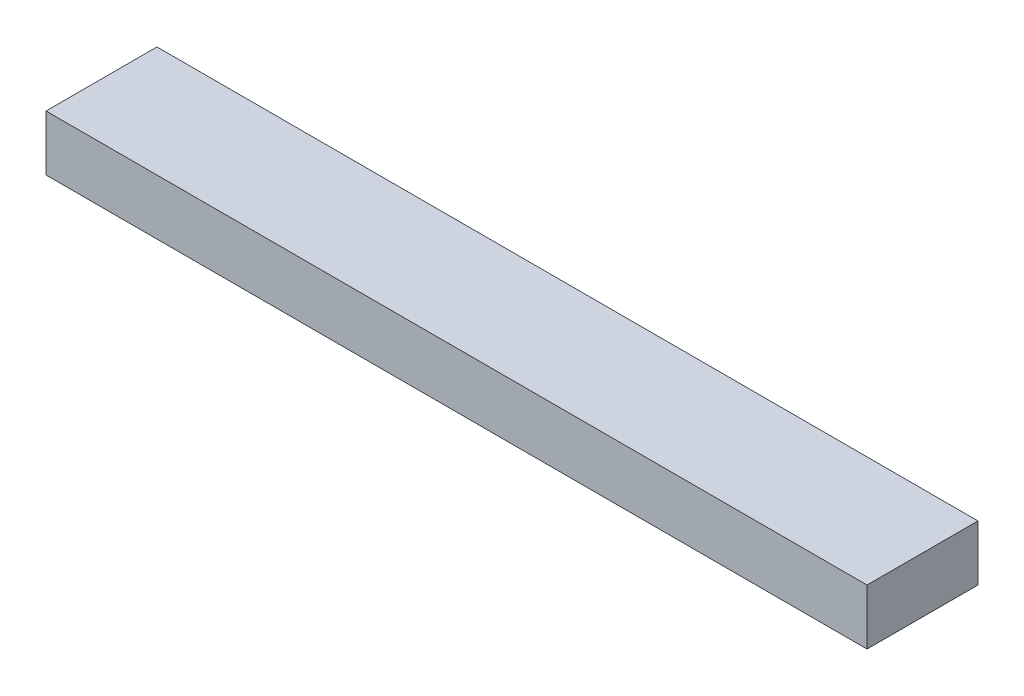
ISO-10303-21;
HEADER;
FILE_DESCRIPTION(('STEP AP214'),'2;1');
FILE_NAME('part.step','',(''),(''),'','','');
FILE_SCHEMA(('AUTOMOTIVE_DESIGN { 1 0 10303 214 1 1 1 1 }'));
ENDSEC;
DATA;
#1=APPLICATION_CONTEXT('core data for automotive mechanical design processes');
#2=APPLICATION_PROTOCOL_DEFINITION('international standard','automotive_design',2000,#1);
#3=PRODUCT_CONTEXT('',#1,'mechanical');
#4=PRODUCT('Part','Part','',(#3));
#5=PRODUCT_RELATED_PRODUCT_CATEGORY('part','',(#4));
#6=PRODUCT_DEFINITION_FORMATION('','',#4);
#7=PRODUCT_DEFINITION_CONTEXT('part definition',#1,'design');
#8=PRODUCT_DEFINITION('design','',#6,#7);
#9=PRODUCT_DEFINITION_SHAPE('','',#8);
#10=(LENGTH_UNIT() NAMED_UNIT(*) SI_UNIT(.MILLI.,.METRE.));
#11=(NAMED_UNIT(*) PLANE_ANGLE_UNIT() SI_UNIT($,.RADIAN.));
#12=(NAMED_UNIT(*) SI_UNIT($,.STERADIAN.) SOLID_ANGLE_UNIT());
#13=UNCERTAINTY_MEASURE_WITH_UNIT(LENGTH_MEASURE(1.E-05),#10,'distance_accuracy_value','');
#14=(GEOMETRIC_REPRESENTATION_CONTEXT(3) GLOBAL_UNCERTAINTY_ASSIGNED_CONTEXT((#13)) GLOBAL_UNIT_ASSIGNED_CONTEXT((#10,
#11,#12)) REPRESENTATION_CONTEXT('',''));
#15=CARTESIAN_POINT('',(0.,0.,0.));
#16=DIRECTION('',(0.,0.,1.));
#17=DIRECTION('',(1.,0.,0.));
#18=AXIS2_PLACEMENT_3D('',#15,#16,#17);
#19=CARTESIAN_POINT('',(23.495,3.175,3.175));
#20=DIRECTION('',(-1.,0.,0.));
#21=DIRECTION('',(0.,0.,1.));
#22=AXIS2_PLACEMENT_3D('',#19,#20,#21);
#23=PLANE('',#22);
#24=DIRECTION('',(0.,0.,-1.));
#25=VECTOR('',#24,1.);
#26=CARTESIAN_POINT('',(23.495,0.,3.175));
#27=LINE('',#26,#25);
#28=CARTESIAN_POINT('',(23.495,0.,3.175));
#29=VERTEX_POINT('',#28);
#30=CARTESIAN_POINT('',(23.495,0.,-3.175));
#31=VERTEX_POINT('',#30);
#32=EDGE_CURVE('E98',#29,#31,#27,.T.);
#33=ORIENTED_EDGE('',*,*,#32,.T.);
#34=DIRECTION('',(0.,-1.,0.));
#35=VECTOR('',#34,1.);
#36=CARTESIAN_POINT('',(23.495,3.175,-3.175));
#37=LINE('',#36,#35);
#38=CARTESIAN_POINT('',(23.495,3.175,-3.175));
#39=VERTEX_POINT('',#38);
#40=EDGE_CURVE('E11',#39,#31,#37,.T.);
#41=ORIENTED_EDGE('',*,*,#40,.F.);
#42=DIRECTION('',(0.,0.,-1.));
#43=VECTOR('',#42,1.);
#44=CARTESIAN_POINT('',(23.495,3.175,3.175));
#45=LINE('',#44,#43);
#46=CARTESIAN_POINT('',(23.495,3.175,3.175));
#47=VERTEX_POINT('',#46);
#48=EDGE_CURVE('E86',#47,#39,#45,.T.);
#49=ORIENTED_EDGE('',*,*,#48,.F.);
#50=DIRECTION('',(0.,-1.,0.));
#51=VECTOR('',#50,1.);
#52=CARTESIAN_POINT('',(23.495,3.175,3.175));
#53=LINE('',#52,#51);
#54=EDGE_CURVE('E94',#47,#29,#53,.T.);
#55=ORIENTED_EDGE('',*,*,#54,.T.);
#56=EDGE_LOOP('',(#33,#41,#49,#55));
#57=FACE_BOUND('',#56,.T.);
#58=ADVANCED_FACE('F35',(#57),#23,.F.);
#59=CARTESIAN_POINT('',(-23.495,3.175,-3.175));
#60=DIRECTION('',(0.,0.,1.));
#61=DIRECTION('',(1.,0.,0.));
#62=AXIS2_PLACEMENT_3D('',#59,#60,#61);
#63=PLANE('',#62);
#64=DIRECTION('',(-1.,0.,0.));
#65=VECTOR('',#64,1.);
#66=CARTESIAN_POINT('',(-23.495,0.,-3.175));
#67=LINE('',#66,#65);
#68=CARTESIAN_POINT('',(-23.495,0.,-3.175));
#69=VERTEX_POINT('',#68);
#70=EDGE_CURVE('E90',#31,#69,#67,.T.);
#71=ORIENTED_EDGE('',*,*,#70,.T.);
#72=DIRECTION('',(0.,-1.,0.));
#73=VECTOR('',#72,1.);
#74=CARTESIAN_POINT('',(-23.495,3.175,-3.175));
#75=LINE('',#74,#73);
#76=CARTESIAN_POINT('',(-23.495,3.175,-3.175));
#77=VERTEX_POINT('',#76);
#78=EDGE_CURVE('E43',#77,#69,#75,.T.);
#79=ORIENTED_EDGE('',*,*,#78,.F.);
#80=DIRECTION('',(-1.,0.,0.));
#81=VECTOR('',#80,1.);
#82=CARTESIAN_POINT('',(-23.495,3.175,-3.175));
#83=LINE('',#82,#81);
#84=EDGE_CURVE('E81',#39,#77,#83,.T.);
#85=ORIENTED_EDGE('',*,*,#84,.F.);
#86=ORIENTED_EDGE('',*,*,#40,.T.);
#87=EDGE_LOOP('',(#71,#79,#85,#86));
#88=FACE_BOUND('',#87,.T.);
#89=ADVANCED_FACE('F89',(#88),#63,.F.);
#90=CARTESIAN_POINT('',(-23.495,3.175,3.175));
#91=DIRECTION('',(1.,0.,0.));
#92=DIRECTION('',(0.,0.,-1.));
#93=AXIS2_PLACEMENT_3D('',#90,#91,#92);
#94=PLANE('',#93);
#95=DIRECTION('',(0.,0.,1.));
#96=VECTOR('',#95,1.);
#97=CARTESIAN_POINT('',(-23.495,0.,3.175));
#98=LINE('',#97,#96);
#99=CARTESIAN_POINT('',(-23.495,0.,3.175));
#100=VERTEX_POINT('',#99);
#101=EDGE_CURVE('E68',#69,#100,#98,.T.);
#102=ORIENTED_EDGE('',*,*,#101,.T.);
#103=DIRECTION('',(0.,-1.,0.));
#104=VECTOR('',#103,1.);
#105=CARTESIAN_POINT('',(-23.495,3.175,3.175));
#106=LINE('',#105,#104);
#107=CARTESIAN_POINT('',(-23.495,3.175,3.175));
#108=VERTEX_POINT('',#107);
#109=EDGE_CURVE('E91',#108,#100,#106,.T.);
#110=ORIENTED_EDGE('',*,*,#109,.F.);
#111=DIRECTION('',(0.,0.,1.));
#112=VECTOR('',#111,1.);
#113=CARTESIAN_POINT('',(-23.495,3.175,3.175));
#114=LINE('',#113,#112);
#115=EDGE_CURVE('E84',#77,#108,#114,.T.);
#116=ORIENTED_EDGE('',*,*,#115,.F.);
#117=ORIENTED_EDGE('',*,*,#78,.T.);
#118=EDGE_LOOP('',(#102,#110,#116,#117));
#119=FACE_BOUND('',#118,.T.);
#120=ADVANCED_FACE('F92',(#119),#94,.F.);
#121=CARTESIAN_POINT('',(-23.495,3.175,3.175));
#122=DIRECTION('',(0.,0.,-1.));
#123=DIRECTION('',(-1.,0.,0.));
#124=AXIS2_PLACEMENT_3D('',#121,#122,#123);
#125=PLANE('',#124);
#126=DIRECTION('',(1.,0.,0.));
#127=VECTOR('',#126,1.);
#128=CARTESIAN_POINT('',(-23.495,0.,3.175));
#129=LINE('',#128,#127);
#130=EDGE_CURVE('E74',#100,#29,#129,.T.);
#131=ORIENTED_EDGE('',*,*,#130,.T.);
#132=ORIENTED_EDGE('',*,*,#54,.F.);
#133=DIRECTION('',(1.,0.,0.));
#134=VECTOR('',#133,1.);
#135=CARTESIAN_POINT('',(-23.495,3.175,3.175));
#136=LINE('',#135,#134);
#137=EDGE_CURVE('E51',#108,#47,#136,.T.);
#138=ORIENTED_EDGE('',*,*,#137,.F.);
#139=ORIENTED_EDGE('',*,*,#109,.T.);
#140=EDGE_LOOP('',(#131,#132,#138,#139));
#141=FACE_BOUND('',#140,.T.);
#142=ADVANCED_FACE('F105',(#141),#125,.F.);
#143=CARTESIAN_POINT('',(0.,3.175,0.));
#144=DIRECTION('',(0.,-1.,0.));
#145=DIRECTION('',(0.,0.,-1.));
#146=AXIS2_PLACEMENT_3D('',#143,#144,#145);
#147=PLANE('',#146);
#148=ORIENTED_EDGE('',*,*,#48,.T.);
#149=ORIENTED_EDGE('',*,*,#84,.T.);
#150=ORIENTED_EDGE('',*,*,#115,.T.);
#151=ORIENTED_EDGE('',*,*,#137,.T.);
#152=EDGE_LOOP('',(#148,#149,#150,#151));
#153=FACE_BOUND('',#152,.T.);
#154=ADVANCED_FACE('F82',(#153),#147,.F.);
#155=CARTESIAN_POINT('',(0.,0.,0.));
#156=DIRECTION('',(0.,-1.,0.));
#157=DIRECTION('',(0.,0.,-1.));
#158=AXIS2_PLACEMENT_3D('',#155,#156,#157);
#159=PLANE('',#158);
#160=ORIENTED_EDGE('',*,*,#32,.F.);
#161=ORIENTED_EDGE('',*,*,#130,.F.);
#162=ORIENTED_EDGE('',*,*,#101,.F.);
#163=ORIENTED_EDGE('',*,*,#70,.F.);
#164=EDGE_LOOP('',(#160,#161,#162,#163));
#165=FACE_BOUND('',#164,.T.);
#166=ADVANCED_FACE('F108',(#165),#159,.T.);
#167=CLOSED_SHELL('',(#58,#89,#120,#142,#154,#166));
#168=MANIFOLD_SOLID_BREP('B2',#167);
#169=ADVANCED_BREP_SHAPE_REPRESENTATION('',(#18,#168),#14);
#170=SHAPE_DEFINITION_REPRESENTATION(#9,#169);
ENDSEC;
END-ISO-10303-21;
